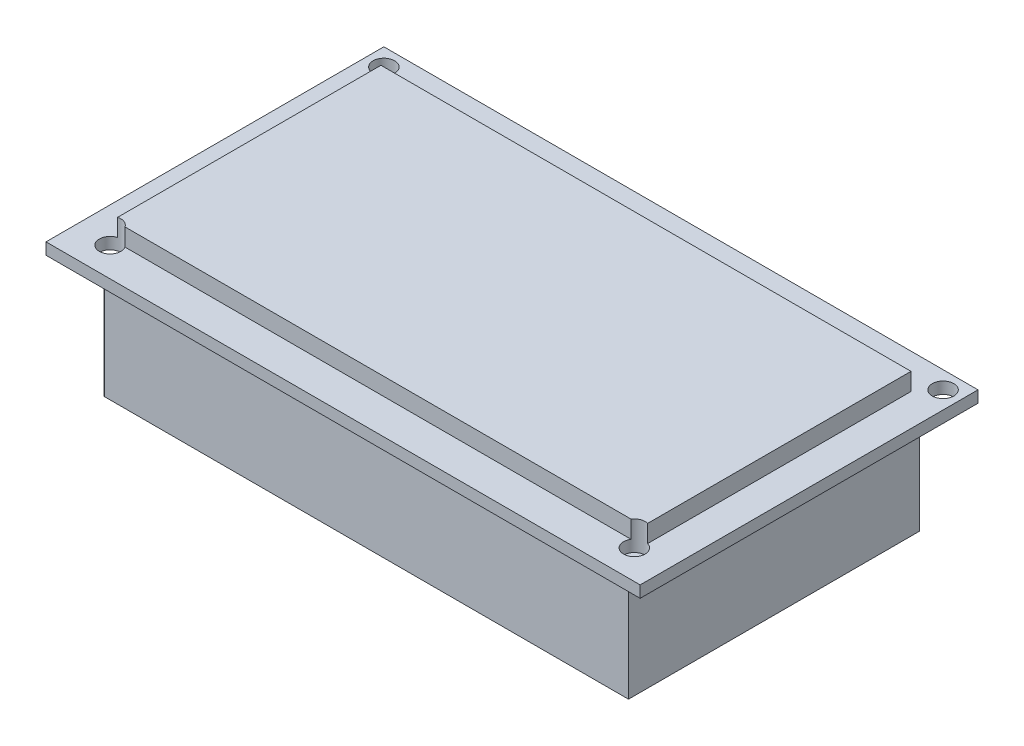
ISO-10303-21;
HEADER;
FILE_DESCRIPTION(('STEP AP214'),'2;1');
FILE_NAME('part.step','',(''),(''),'','','');
FILE_SCHEMA(('AUTOMOTIVE_DESIGN { 1 0 10303 214 1 1 1 1 }'));
ENDSEC;
DATA;
#1=APPLICATION_CONTEXT('core data for automotive mechanical design processes');
#2=APPLICATION_PROTOCOL_DEFINITION('international standard','automotive_design',2000,#1);
#3=PRODUCT_CONTEXT('',#1,'mechanical');
#4=PRODUCT('Part','Part','',(#3));
#5=PRODUCT_RELATED_PRODUCT_CATEGORY('part','',(#4));
#6=PRODUCT_DEFINITION_FORMATION('','',#4);
#7=PRODUCT_DEFINITION_CONTEXT('part definition',#1,'design');
#8=PRODUCT_DEFINITION('design','',#6,#7);
#9=PRODUCT_DEFINITION_SHAPE('','',#8);
#10=(LENGTH_UNIT() NAMED_UNIT(*) SI_UNIT(.MILLI.,.METRE.));
#11=(NAMED_UNIT(*) PLANE_ANGLE_UNIT() SI_UNIT($,.RADIAN.));
#12=(NAMED_UNIT(*) SI_UNIT($,.STERADIAN.) SOLID_ANGLE_UNIT());
#13=UNCERTAINTY_MEASURE_WITH_UNIT(LENGTH_MEASURE(1.E-05),#10,'distance_accuracy_value','');
#14=(GEOMETRIC_REPRESENTATION_CONTEXT(3) GLOBAL_UNCERTAINTY_ASSIGNED_CONTEXT((#13)) GLOBAL_UNIT_ASSIGNED_CONTEXT((#10,
#11,#12)) REPRESENTATION_CONTEXT('',''));
#15=CARTESIAN_POINT('',(0.,0.,0.));
#16=DIRECTION('',(0.,0.,1.));
#17=DIRECTION('',(1.,0.,0.));
#18=AXIS2_PLACEMENT_3D('',#15,#16,#17);
#19=CARTESIAN_POINT('',(0.,0.,0.));
#20=DIRECTION('',(0.,1.,0.));
#21=DIRECTION('',(0.,0.,1.));
#22=AXIS2_PLACEMENT_3D('',#19,#20,#21);
#23=PLANE('',#22);
#24=CARTESIAN_POINT('',(-48.,0.,-26.));
#25=DIRECTION('',(0.,-1.,0.));
#26=DIRECTION('',(0.,0.,-1.));
#27=AXIS2_PLACEMENT_3D('',#24,#25,#26);
#28=CIRCLE('',#27,1.85);
#29=CARTESIAN_POINT('',(-48.,0.,-27.85));
#30=VERTEX_POINT('',#29);
#31=EDGE_CURVE('E347',#30,#30,#28,.T.);
#32=ORIENTED_EDGE('',*,*,#31,.F.);
#33=EDGE_LOOP('',(#32));
#34=FACE_BOUND('',#33,.T.);
#35=CARTESIAN_POINT('',(48.,0.,-26.));
#36=DIRECTION('',(0.,-1.,0.));
#37=DIRECTION('',(0.,0.,-1.));
#38=AXIS2_PLACEMENT_3D('',#35,#36,#37);
#39=CIRCLE('',#38,1.85);
#40=CARTESIAN_POINT('',(48.,0.,-27.85));
#41=VERTEX_POINT('',#40);
#42=EDGE_CURVE('E350',#41,#41,#39,.T.);
#43=ORIENTED_EDGE('',*,*,#42,.F.);
#44=EDGE_LOOP('',(#43));
#45=FACE_BOUND('',#44,.T.);
#46=DIRECTION('',(0.,0.,-1.));
#47=VECTOR('',#46,1.);
#48=CARTESIAN_POINT('',(51.,0.,-29.));
#49=LINE('',#48,#47);
#50=CARTESIAN_POINT('',(51.,0.,29.));
#51=VERTEX_POINT('',#50);
#52=CARTESIAN_POINT('',(51.,0.,-29.));
#53=VERTEX_POINT('',#52);
#54=EDGE_CURVE('E254',#51,#53,#49,.T.);
#55=ORIENTED_EDGE('',*,*,#54,.F.);
#56=DIRECTION('',(1.,0.,0.));
#57=VECTOR('',#56,1.);
#58=CARTESIAN_POINT('',(-51.,0.,29.));
#59=LINE('',#58,#57);
#60=CARTESIAN_POINT('',(-51.,0.,29.));
#61=VERTEX_POINT('',#60);
#62=EDGE_CURVE('E260',#61,#51,#59,.T.);
#63=ORIENTED_EDGE('',*,*,#62,.F.);
#64=DIRECTION('',(0.,0.,1.));
#65=VECTOR('',#64,1.);
#66=CARTESIAN_POINT('',(-51.,0.,-29.));
#67=LINE('',#66,#65);
#68=CARTESIAN_POINT('',(-51.,0.,-29.));
#69=VERTEX_POINT('',#68);
#70=EDGE_CURVE('E276',#69,#61,#67,.T.);
#71=ORIENTED_EDGE('',*,*,#70,.F.);
#72=DIRECTION('',(-1.,0.,0.));
#73=VECTOR('',#72,1.);
#74=CARTESIAN_POINT('',(-51.,0.,-29.));
#75=LINE('',#74,#73);
#76=EDGE_CURVE('E273',#53,#69,#75,.T.);
#77=ORIENTED_EDGE('',*,*,#76,.F.);
#78=EDGE_LOOP('',(#55,#63,#71,#77));
#79=FACE_BOUND('',#78,.T.);
#80=DIRECTION('',(-1.,0.,0.));
#81=VECTOR('',#80,1.);
#82=CARTESIAN_POINT('',(-45.,0.,25.));
#83=LINE('',#82,#81);
#84=CARTESIAN_POINT('',(43.4435617583726,0.,25.));
#85=VERTEX_POINT('',#84);
#86=CARTESIAN_POINT('',(-43.4435617583727,0.,25.));
#87=VERTEX_POINT('',#86);
#88=EDGE_CURVE('E177',#85,#87,#83,.T.);
#89=ORIENTED_EDGE('',*,*,#88,.F.);
#90=CARTESIAN_POINT('',(45.,0.,24.));
#91=DIRECTION('',(0.,-1.,0.));
#92=DIRECTION('',(0.,0.,-1.));
#93=AXIS2_PLACEMENT_3D('',#90,#91,#92);
#94=CIRCLE('',#93,1.85);
#95=CARTESIAN_POINT('',(45.,0.,22.15));
#96=VERTEX_POINT('',#95);
#97=EDGE_CURVE('E182',#96,#85,#94,.T.);
#98=ORIENTED_EDGE('',*,*,#97,.F.);
#99=DIRECTION('',(0.,0.,1.));
#100=VECTOR('',#99,1.);
#101=CARTESIAN_POINT('',(45.,0.,25.));
#102=LINE('',#101,#100);
#103=CARTESIAN_POINT('',(45.,0.,-25.));
#104=VERTEX_POINT('',#103);
#105=EDGE_CURVE('E187',#104,#96,#102,.T.);
#106=ORIENTED_EDGE('',*,*,#105,.F.);
#107=DIRECTION('',(1.,0.,0.));
#108=VECTOR('',#107,1.);
#109=CARTESIAN_POINT('',(-45.,0.,-25.));
#110=LINE('',#109,#108);
#111=CARTESIAN_POINT('',(-45.,0.,-25.));
#112=VERTEX_POINT('',#111);
#113=EDGE_CURVE('E197',#112,#104,#110,.T.);
#114=ORIENTED_EDGE('',*,*,#113,.F.);
#115=DIRECTION('',(0.,0.,-1.));
#116=VECTOR('',#115,1.);
#117=CARTESIAN_POINT('',(-45.,0.,25.));
#118=LINE('',#117,#116);
#119=CARTESIAN_POINT('',(-45.,0.,22.15));
#120=VERTEX_POINT('',#119);
#121=EDGE_CURVE('E180',#120,#112,#118,.T.);
#122=ORIENTED_EDGE('',*,*,#121,.F.);
#123=CARTESIAN_POINT('',(-45.,0.,24.));
#124=DIRECTION('',(0.,-1.,0.));
#125=DIRECTION('',(0.,0.,-1.));
#126=AXIS2_PLACEMENT_3D('',#123,#124,#125);
#127=CIRCLE('',#126,1.85);
#128=EDGE_CURVE('E170',#87,#120,#127,.T.);
#129=ORIENTED_EDGE('',*,*,#128,.F.);
#130=EDGE_LOOP('',(#89,#98,#106,#114,#122,#129));
#131=FACE_BOUND('',#130,.T.);
#132=ADVANCED_FACE('F39',(#34,#45,#79,#131),#23,.F.);
#133=CARTESIAN_POINT('',(51.,2.,-29.));
#134=DIRECTION('',(-1.,0.,0.));
#135=DIRECTION('',(0.,0.,1.));
#136=AXIS2_PLACEMENT_3D('',#133,#134,#135);
#137=PLANE('',#136);
#138=ORIENTED_EDGE('',*,*,#54,.T.);
#139=DIRECTION('',(0.,-1.,0.));
#140=VECTOR('',#139,1.);
#141=CARTESIAN_POINT('',(51.,2.,-29.));
#142=LINE('',#141,#140);
#143=CARTESIAN_POINT('',(51.,2.,-29.));
#144=VERTEX_POINT('',#143);
#145=EDGE_CURVE('E292',#144,#53,#142,.T.);
#146=ORIENTED_EDGE('',*,*,#145,.F.);
#147=DIRECTION('',(0.,0.,-1.));
#148=VECTOR('',#147,1.);
#149=CARTESIAN_POINT('',(51.,2.,-29.));
#150=LINE('',#149,#148);
#151=CARTESIAN_POINT('',(51.,2.,29.));
#152=VERTEX_POINT('',#151);
#153=EDGE_CURVE('E255',#152,#144,#150,.T.);
#154=ORIENTED_EDGE('',*,*,#153,.F.);
#155=DIRECTION('',(0.,-1.,0.));
#156=VECTOR('',#155,1.);
#157=CARTESIAN_POINT('',(51.,2.,29.));
#158=LINE('',#157,#156);
#159=EDGE_CURVE('E269',#152,#51,#158,.T.);
#160=ORIENTED_EDGE('',*,*,#159,.T.);
#161=EDGE_LOOP('',(#138,#146,#154,#160));
#162=FACE_BOUND('',#161,.T.);
#163=ADVANCED_FACE('F41',(#162),#137,.F.);
#164=CARTESIAN_POINT('',(-51.,2.,-29.));
#165=DIRECTION('',(0.,0.,1.));
#166=DIRECTION('',(1.,0.,0.));
#167=AXIS2_PLACEMENT_3D('',#164,#165,#166);
#168=PLANE('',#167);
#169=ORIENTED_EDGE('',*,*,#76,.T.);
#170=DIRECTION('',(0.,-1.,0.));
#171=VECTOR('',#170,1.);
#172=CARTESIAN_POINT('',(-51.,2.,-29.));
#173=LINE('',#172,#171);
#174=CARTESIAN_POINT('',(-51.,2.,-29.));
#175=VERTEX_POINT('',#174);
#176=EDGE_CURVE('E288',#175,#69,#173,.T.);
#177=ORIENTED_EDGE('',*,*,#176,.F.);
#178=DIRECTION('',(-1.,0.,0.));
#179=VECTOR('',#178,1.);
#180=CARTESIAN_POINT('',(-51.,2.,-29.));
#181=LINE('',#180,#179);
#182=EDGE_CURVE('E259',#144,#175,#181,.T.);
#183=ORIENTED_EDGE('',*,*,#182,.F.);
#184=ORIENTED_EDGE('',*,*,#145,.T.);
#185=EDGE_LOOP('',(#169,#177,#183,#184));
#186=FACE_BOUND('',#185,.T.);
#187=ADVANCED_FACE('F406',(#186),#168,.F.);
#188=CARTESIAN_POINT('',(-51.,2.,-29.));
#189=DIRECTION('',(1.,0.,0.));
#190=DIRECTION('',(0.,0.,-1.));
#191=AXIS2_PLACEMENT_3D('',#188,#189,#190);
#192=PLANE('',#191);
#193=ORIENTED_EDGE('',*,*,#70,.T.);
#194=DIRECTION('',(0.,-1.,0.));
#195=VECTOR('',#194,1.);
#196=CARTESIAN_POINT('',(-51.,2.,29.));
#197=LINE('',#196,#195);
#198=CARTESIAN_POINT('',(-51.,2.,29.));
#199=VERTEX_POINT('',#198);
#200=EDGE_CURVE('E284',#199,#61,#197,.T.);
#201=ORIENTED_EDGE('',*,*,#200,.F.);
#202=DIRECTION('',(0.,0.,1.));
#203=VECTOR('',#202,1.);
#204=CARTESIAN_POINT('',(-51.,2.,-29.));
#205=LINE('',#204,#203);
#206=EDGE_CURVE('E263',#175,#199,#205,.T.);
#207=ORIENTED_EDGE('',*,*,#206,.F.);
#208=ORIENTED_EDGE('',*,*,#176,.T.);
#209=EDGE_LOOP('',(#193,#201,#207,#208));
#210=FACE_BOUND('',#209,.T.);
#211=ADVANCED_FACE('F416',(#210),#192,.F.);
#212=CARTESIAN_POINT('',(-51.,2.,29.));
#213=DIRECTION('',(0.,0.,-1.));
#214=DIRECTION('',(-1.,0.,0.));
#215=AXIS2_PLACEMENT_3D('',#212,#213,#214);
#216=PLANE('',#215);
#217=ORIENTED_EDGE('',*,*,#62,.T.);
#218=ORIENTED_EDGE('',*,*,#159,.F.);
#219=DIRECTION('',(1.,0.,0.));
#220=VECTOR('',#219,1.);
#221=CARTESIAN_POINT('',(-51.,2.,29.));
#222=LINE('',#221,#220);
#223=EDGE_CURVE('E266',#199,#152,#222,.T.);
#224=ORIENTED_EDGE('',*,*,#223,.F.);
#225=ORIENTED_EDGE('',*,*,#200,.T.);
#226=EDGE_LOOP('',(#217,#218,#224,#225));
#227=FACE_BOUND('',#226,.T.);
#228=ADVANCED_FACE('F413',(#227),#216,.F.);
#229=CARTESIAN_POINT('',(0.,2.,0.));
#230=DIRECTION('',(0.,1.,0.));
#231=DIRECTION('',(0.,0.,1.));
#232=AXIS2_PLACEMENT_3D('',#229,#230,#231);
#233=PLANE('',#232);
#234=CARTESIAN_POINT('',(45.,2.,24.));
#235=DIRECTION('',(0.,1.,0.));
#236=DIRECTION('',(0.,0.,1.));
#237=AXIS2_PLACEMENT_3D('',#234,#235,#236);
#238=CIRCLE('',#237,1.85);
#239=CARTESIAN_POINT('',(43.4435617583727,2.,23.));
#240=VERTEX_POINT('',#239);
#241=CARTESIAN_POINT('',(45.5,2.,22.2188486869443));
#242=VERTEX_POINT('',#241);
#243=EDGE_CURVE('E305',#240,#242,#238,.T.);
#244=ORIENTED_EDGE('',*,*,#243,.F.);
#245=DIRECTION('',(1.,0.,0.));
#246=VECTOR('',#245,1.);
#247=CARTESIAN_POINT('',(-45.5,2.,23.));
#248=LINE('',#247,#246);
#249=CARTESIAN_POINT('',(-43.4435617583727,2.,23.));
#250=VERTEX_POINT('',#249);
#251=EDGE_CURVE('E222',#250,#240,#248,.T.);
#252=ORIENTED_EDGE('',*,*,#251,.F.);
#253=CARTESIAN_POINT('',(-45.,2.,24.));
#254=DIRECTION('',(0.,1.,0.));
#255=DIRECTION('',(0.,0.,1.));
#256=AXIS2_PLACEMENT_3D('',#253,#254,#255);
#257=CIRCLE('',#256,1.85);
#258=CARTESIAN_POINT('',(-45.5,2.,22.2188486869443));
#259=VERTEX_POINT('',#258);
#260=EDGE_CURVE('E358',#259,#250,#257,.T.);
#261=ORIENTED_EDGE('',*,*,#260,.F.);
#262=DIRECTION('',(0.,0.,1.));
#263=VECTOR('',#262,1.);
#264=CARTESIAN_POINT('',(-45.5,2.,-23.));
#265=LINE('',#264,#263);
#266=CARTESIAN_POINT('',(-45.5,2.,-23.));
#267=VERTEX_POINT('',#266);
#268=EDGE_CURVE('E240',#267,#259,#265,.T.);
#269=ORIENTED_EDGE('',*,*,#268,.F.);
#270=DIRECTION('',(-1.,0.,0.));
#271=VECTOR('',#270,1.);
#272=CARTESIAN_POINT('',(-45.5,2.,-23.));
#273=LINE('',#272,#271);
#274=CARTESIAN_POINT('',(45.5,2.,-23.));
#275=VERTEX_POINT('',#274);
#276=EDGE_CURVE('E236',#275,#267,#273,.T.);
#277=ORIENTED_EDGE('',*,*,#276,.F.);
#278=DIRECTION('',(0.,0.,-1.));
#279=VECTOR('',#278,1.);
#280=CARTESIAN_POINT('',(45.5,2.,-23.));
#281=LINE('',#280,#279);
#282=EDGE_CURVE('E217',#242,#275,#281,.T.);
#283=ORIENTED_EDGE('',*,*,#282,.F.);
#284=EDGE_LOOP('',(#244,#252,#261,#269,#277,#283));
#285=FACE_BOUND('',#284,.T.);
#286=CARTESIAN_POINT('',(-48.,2.,-26.));
#287=DIRECTION('',(0.,1.,0.));
#288=DIRECTION('',(0.,0.,1.));
#289=AXIS2_PLACEMENT_3D('',#286,#287,#288);
#290=CIRCLE('',#289,1.85);
#291=CARTESIAN_POINT('',(-48.,2.,-24.15));
#292=VERTEX_POINT('',#291);
#293=EDGE_CURVE('E43',#292,#292,#290,.T.);
#294=ORIENTED_EDGE('',*,*,#293,.F.);
#295=EDGE_LOOP('',(#294));
#296=FACE_BOUND('',#295,.T.);
#297=CARTESIAN_POINT('',(48.,2.,-26.));
#298=DIRECTION('',(0.,1.,0.));
#299=DIRECTION('',(0.,0.,1.));
#300=AXIS2_PLACEMENT_3D('',#297,#298,#299);
#301=CIRCLE('',#300,1.85);
#302=CARTESIAN_POINT('',(48.,2.,-24.15));
#303=VERTEX_POINT('',#302);
#304=EDGE_CURVE('E297',#303,#303,#301,.T.);
#305=ORIENTED_EDGE('',*,*,#304,.F.);
#306=EDGE_LOOP('',(#305));
#307=FACE_BOUND('',#306,.T.);
#308=ORIENTED_EDGE('',*,*,#153,.T.);
#309=ORIENTED_EDGE('',*,*,#182,.T.);
#310=ORIENTED_EDGE('',*,*,#206,.T.);
#311=ORIENTED_EDGE('',*,*,#223,.T.);
#312=EDGE_LOOP('',(#308,#309,#310,#311));
#313=FACE_BOUND('',#312,.T.);
#314=ADVANCED_FACE('F380',(#285,#296,#307,#313),#233,.T.);
#315=CARTESIAN_POINT('',(45.5,5.,-23.));
#316=DIRECTION('',(-1.,0.,0.));
#317=DIRECTION('',(0.,0.,1.));
#318=AXIS2_PLACEMENT_3D('',#315,#316,#317);
#319=PLANE('',#318);
#320=DIRECTION('',(0.,0.,-1.));
#321=VECTOR('',#320,1.);
#322=CARTESIAN_POINT('',(45.5,5.,-23.));
#323=LINE('',#322,#321);
#324=CARTESIAN_POINT('',(45.5,5.,22.2188486869443));
#325=VERTEX_POINT('',#324);
#326=CARTESIAN_POINT('',(45.5,5.,-23.));
#327=VERTEX_POINT('',#326);
#328=EDGE_CURVE('E218',#325,#327,#323,.T.);
#329=ORIENTED_EDGE('',*,*,#328,.F.);
#330=DIRECTION('',(0.,-1.,0.));
#331=VECTOR('',#330,1.);
#332=CARTESIAN_POINT('',(45.5,5.,22.2188486869443));
#333=LINE('',#332,#331);
#334=EDGE_CURVE('E64',#325,#242,#333,.T.);
#335=ORIENTED_EDGE('',*,*,#334,.T.);
#336=ORIENTED_EDGE('',*,*,#282,.T.);
#337=DIRECTION('',(0.,-1.,0.));
#338=VECTOR('',#337,1.);
#339=CARTESIAN_POINT('',(45.5,5.,-23.));
#340=LINE('',#339,#338);
#341=EDGE_CURVE('E250',#327,#275,#340,.T.);
#342=ORIENTED_EDGE('',*,*,#341,.F.);
#343=EDGE_LOOP('',(#329,#335,#336,#342));
#344=FACE_BOUND('',#343,.T.);
#345=ADVANCED_FACE('F386',(#344),#319,.F.);
#346=CARTESIAN_POINT('',(-45.5,5.,-23.));
#347=DIRECTION('',(0.,0.,1.));
#348=DIRECTION('',(1.,0.,0.));
#349=AXIS2_PLACEMENT_3D('',#346,#347,#348);
#350=PLANE('',#349);
#351=ORIENTED_EDGE('',*,*,#276,.T.);
#352=DIRECTION('',(0.,-1.,0.));
#353=VECTOR('',#352,1.);
#354=CARTESIAN_POINT('',(-45.5,5.,-23.));
#355=LINE('',#354,#353);
#356=CARTESIAN_POINT('',(-45.5,5.,-23.));
#357=VERTEX_POINT('',#356);
#358=EDGE_CURVE('E233',#357,#267,#355,.T.);
#359=ORIENTED_EDGE('',*,*,#358,.F.);
#360=DIRECTION('',(-1.,0.,0.));
#361=VECTOR('',#360,1.);
#362=CARTESIAN_POINT('',(-45.5,5.,-23.));
#363=LINE('',#362,#361);
#364=EDGE_CURVE('E221',#327,#357,#363,.T.);
#365=ORIENTED_EDGE('',*,*,#364,.F.);
#366=ORIENTED_EDGE('',*,*,#341,.T.);
#367=EDGE_LOOP('',(#351,#359,#365,#366));
#368=FACE_BOUND('',#367,.T.);
#369=ADVANCED_FACE('F383',(#368),#350,.F.);
#370=CARTESIAN_POINT('',(-45.5,5.,-23.));
#371=DIRECTION('',(1.,0.,0.));
#372=DIRECTION('',(0.,0.,-1.));
#373=AXIS2_PLACEMENT_3D('',#370,#371,#372);
#374=PLANE('',#373);
#375=ORIENTED_EDGE('',*,*,#268,.T.);
#376=DIRECTION('',(0.,-1.,0.));
#377=VECTOR('',#376,1.);
#378=CARTESIAN_POINT('',(-45.5,5.,22.2188486869443));
#379=LINE('',#378,#377);
#380=CARTESIAN_POINT('',(-45.5,5.,22.2188486869443));
#381=VERTEX_POINT('',#380);
#382=EDGE_CURVE('E361',#259,#381,#379,.F.);
#383=ORIENTED_EDGE('',*,*,#382,.T.);
#384=DIRECTION('',(0.,0.,1.));
#385=VECTOR('',#384,1.);
#386=CARTESIAN_POINT('',(-45.5,5.,-23.));
#387=LINE('',#386,#385);
#388=EDGE_CURVE('E225',#357,#381,#387,.T.);
#389=ORIENTED_EDGE('',*,*,#388,.F.);
#390=ORIENTED_EDGE('',*,*,#358,.T.);
#391=EDGE_LOOP('',(#375,#383,#389,#390));
#392=FACE_BOUND('',#391,.T.);
#393=ADVANCED_FACE('F376',(#392),#374,.F.);
#394=CARTESIAN_POINT('',(-45.5,5.,23.));
#395=DIRECTION('',(0.,0.,-1.));
#396=DIRECTION('',(-1.,0.,0.));
#397=AXIS2_PLACEMENT_3D('',#394,#395,#396);
#398=PLANE('',#397);
#399=ORIENTED_EDGE('',*,*,#251,.T.);
#400=DIRECTION('',(0.,-1.,0.));
#401=VECTOR('',#400,1.);
#402=CARTESIAN_POINT('',(43.4435617583727,5.,23.));
#403=LINE('',#402,#401);
#404=CARTESIAN_POINT('',(43.4435617583727,5.,23.));
#405=VERTEX_POINT('',#404);
#406=EDGE_CURVE('E311',#240,#405,#403,.F.);
#407=ORIENTED_EDGE('',*,*,#406,.T.);
#408=DIRECTION('',(1.,0.,0.));
#409=VECTOR('',#408,1.);
#410=CARTESIAN_POINT('',(-45.5,5.,23.));
#411=LINE('',#410,#409);
#412=CARTESIAN_POINT('',(-43.4435617583727,5.,23.));
#413=VERTEX_POINT('',#412);
#414=EDGE_CURVE('E229',#413,#405,#411,.T.);
#415=ORIENTED_EDGE('',*,*,#414,.F.);
#416=DIRECTION('',(0.,-1.,0.));
#417=VECTOR('',#416,1.);
#418=CARTESIAN_POINT('',(-43.4435617583727,5.,23.));
#419=LINE('',#418,#417);
#420=EDGE_CURVE('E57',#413,#250,#419,.T.);
#421=ORIENTED_EDGE('',*,*,#420,.T.);
#422=EDGE_LOOP('',(#399,#407,#415,#421));
#423=FACE_BOUND('',#422,.T.);
#424=ADVANCED_FACE('F368',(#423),#398,.F.);
#425=CARTESIAN_POINT('',(0.,5.,0.));
#426=DIRECTION('',(0.,1.,0.));
#427=DIRECTION('',(0.,0.,1.));
#428=AXIS2_PLACEMENT_3D('',#425,#426,#427);
#429=PLANE('',#428);
#430=CARTESIAN_POINT('',(45.,5.,24.));
#431=DIRECTION('',(0.,1.,0.));
#432=DIRECTION('',(0.,0.,1.));
#433=AXIS2_PLACEMENT_3D('',#430,#431,#432);
#434=CIRCLE('',#433,1.85);
#435=EDGE_CURVE('E11',#325,#405,#434,.T.);
#436=ORIENTED_EDGE('',*,*,#435,.F.);
#437=ORIENTED_EDGE('',*,*,#328,.T.);
#438=ORIENTED_EDGE('',*,*,#364,.T.);
#439=ORIENTED_EDGE('',*,*,#388,.T.);
#440=CARTESIAN_POINT('',(-45.,5.,24.));
#441=DIRECTION('',(0.,1.,0.));
#442=DIRECTION('',(0.,0.,1.));
#443=AXIS2_PLACEMENT_3D('',#440,#441,#442);
#444=CIRCLE('',#443,1.85);
#445=EDGE_CURVE('E49',#413,#381,#444,.T.);
#446=ORIENTED_EDGE('',*,*,#445,.F.);
#447=ORIENTED_EDGE('',*,*,#414,.T.);
#448=EDGE_LOOP('',(#436,#437,#438,#439,#446,#447));
#449=FACE_BOUND('',#448,.T.);
#450=ADVANCED_FACE('F372',(#449),#429,.T.);
#451=CARTESIAN_POINT('',(45.,-20.,25.));
#452=DIRECTION('',(-1.,0.,0.));
#453=DIRECTION('',(0.,0.,1.));
#454=AXIS2_PLACEMENT_3D('',#451,#452,#453);
#455=PLANE('',#454);
#456=ORIENTED_EDGE('',*,*,#105,.T.);
#457=DIRECTION('',(0.,0.,1.));
#458=VECTOR('',#457,1.);
#459=CARTESIAN_POINT('',(45.,0.,25.));
#460=LINE('',#459,#458);
#461=CARTESIAN_POINT('',(45.,0.,25.));
#462=VERTEX_POINT('',#461);
#463=EDGE_CURVE('E165',#96,#462,#460,.T.);
#464=ORIENTED_EDGE('',*,*,#463,.T.);
#465=DIRECTION('',(0.,1.,0.));
#466=VECTOR('',#465,1.);
#467=CARTESIAN_POINT('',(45.,-20.,25.));
#468=LINE('',#467,#466);
#469=CARTESIAN_POINT('',(45.,-20.,25.));
#470=VERTEX_POINT('',#469);
#471=EDGE_CURVE('E214',#470,#462,#468,.T.);
#472=ORIENTED_EDGE('',*,*,#471,.F.);
#473=DIRECTION('',(0.,0.,1.));
#474=VECTOR('',#473,1.);
#475=CARTESIAN_POINT('',(45.,-20.,25.));
#476=LINE('',#475,#474);
#477=CARTESIAN_POINT('',(45.,-20.,-25.));
#478=VERTEX_POINT('',#477);
#479=EDGE_CURVE('E201',#478,#470,#476,.T.);
#480=ORIENTED_EDGE('',*,*,#479,.F.);
#481=DIRECTION('',(0.,1.,0.));
#482=VECTOR('',#481,1.);
#483=CARTESIAN_POINT('',(45.,-20.,-25.));
#484=LINE('',#483,#482);
#485=EDGE_CURVE('E202',#478,#104,#484,.T.);
#486=ORIENTED_EDGE('',*,*,#485,.T.);
#487=EDGE_LOOP('',(#456,#464,#472,#480,#486));
#488=FACE_BOUND('',#487,.T.);
#489=ADVANCED_FACE('F335',(#488),#455,.F.);
#490=CARTESIAN_POINT('',(-45.,-20.,25.));
#491=DIRECTION('',(0.,0.,-1.));
#492=DIRECTION('',(-1.,0.,0.));
#493=AXIS2_PLACEMENT_3D('',#490,#491,#492);
#494=PLANE('',#493);
#495=EDGE_CURVE('E185',#462,#85,#83,.T.);
#496=ORIENTED_EDGE('',*,*,#495,.T.);
#497=ORIENTED_EDGE('',*,*,#88,.T.);
#498=DIRECTION('',(-1.,0.,0.));
#499=VECTOR('',#498,1.);
#500=CARTESIAN_POINT('',(-45.,0.,25.));
#501=LINE('',#500,#499);
#502=CARTESIAN_POINT('',(-45.,0.,25.));
#503=VERTEX_POINT('',#502);
#504=EDGE_CURVE('E153',#87,#503,#501,.T.);
#505=ORIENTED_EDGE('',*,*,#504,.T.);
#506=DIRECTION('',(0.,1.,0.));
#507=VECTOR('',#506,1.);
#508=CARTESIAN_POINT('',(-45.,-20.,25.));
#509=LINE('',#508,#507);
#510=CARTESIAN_POINT('',(-45.,-20.,25.));
#511=VERTEX_POINT('',#510);
#512=EDGE_CURVE('E211',#511,#503,#509,.T.);
#513=ORIENTED_EDGE('',*,*,#512,.F.);
#514=DIRECTION('',(-1.,0.,0.));
#515=VECTOR('',#514,1.);
#516=CARTESIAN_POINT('',(-45.,-20.,25.));
#517=LINE('',#516,#515);
#518=EDGE_CURVE('E318',#470,#511,#517,.T.);
#519=ORIENTED_EDGE('',*,*,#518,.F.);
#520=ORIENTED_EDGE('',*,*,#471,.T.);
#521=EDGE_LOOP('',(#496,#497,#505,#513,#519,#520));
#522=FACE_BOUND('',#521,.T.);
#523=ADVANCED_FACE('F183',(#522),#494,.F.);
#524=CARTESIAN_POINT('',(-45.,-20.,25.));
#525=DIRECTION('',(1.,0.,0.));
#526=DIRECTION('',(0.,0.,-1.));
#527=AXIS2_PLACEMENT_3D('',#524,#525,#526);
#528=PLANE('',#527);
#529=EDGE_CURVE('E159',#503,#120,#118,.T.);
#530=ORIENTED_EDGE('',*,*,#529,.T.);
#531=ORIENTED_EDGE('',*,*,#121,.T.);
#532=DIRECTION('',(0.,1.,0.));
#533=VECTOR('',#532,1.);
#534=CARTESIAN_POINT('',(-45.,-20.,-25.));
#535=LINE('',#534,#533);
#536=CARTESIAN_POINT('',(-45.,-20.,-25.));
#537=VERTEX_POINT('',#536);
#538=EDGE_CURVE('E206',#537,#112,#535,.T.);
#539=ORIENTED_EDGE('',*,*,#538,.F.);
#540=DIRECTION('',(0.,0.,-1.));
#541=VECTOR('',#540,1.);
#542=CARTESIAN_POINT('',(-45.,-20.,25.));
#543=LINE('',#542,#541);
#544=EDGE_CURVE('E321',#511,#537,#543,.T.);
#545=ORIENTED_EDGE('',*,*,#544,.F.);
#546=ORIENTED_EDGE('',*,*,#512,.T.);
#547=EDGE_LOOP('',(#530,#531,#539,#545,#546));
#548=FACE_BOUND('',#547,.T.);
#549=ADVANCED_FACE('F338',(#548),#528,.F.);
#550=CARTESIAN_POINT('',(-45.,-20.,-25.));
#551=DIRECTION('',(0.,0.,1.));
#552=DIRECTION('',(1.,0.,0.));
#553=AXIS2_PLACEMENT_3D('',#550,#551,#552);
#554=PLANE('',#553);
#555=ORIENTED_EDGE('',*,*,#113,.T.);
#556=ORIENTED_EDGE('',*,*,#485,.F.);
#557=DIRECTION('',(1.,0.,0.));
#558=VECTOR('',#557,1.);
#559=CARTESIAN_POINT('',(-45.,-20.,-25.));
#560=LINE('',#559,#558);
#561=EDGE_CURVE('E207',#537,#478,#560,.T.);
#562=ORIENTED_EDGE('',*,*,#561,.F.);
#563=ORIENTED_EDGE('',*,*,#538,.T.);
#564=EDGE_LOOP('',(#555,#556,#562,#563));
#565=FACE_BOUND('',#564,.T.);
#566=ADVANCED_FACE('F333',(#565),#554,.F.);
#567=CARTESIAN_POINT('',(0.,-20.,0.));
#568=DIRECTION('',(0.,-1.,0.));
#569=DIRECTION('',(0.,0.,-1.));
#570=AXIS2_PLACEMENT_3D('',#567,#568,#569);
#571=PLANE('',#570);
#572=ORIENTED_EDGE('',*,*,#479,.T.);
#573=ORIENTED_EDGE('',*,*,#518,.T.);
#574=ORIENTED_EDGE('',*,*,#544,.T.);
#575=ORIENTED_EDGE('',*,*,#561,.T.);
#576=EDGE_LOOP('',(#572,#573,#574,#575));
#577=FACE_BOUND('',#576,.T.);
#578=ADVANCED_FACE('F327',(#577),#571,.T.);
#579=CARTESIAN_POINT('',(-45.,5.,24.));
#580=DIRECTION('',(0.,-1.,0.));
#581=DIRECTION('',(0.,0.,-1.));
#582=AXIS2_PLACEMENT_3D('',#579,#580,#581);
#583=CYLINDRICAL_SURFACE('',#582,1.85);
#584=EDGE_CURVE('E156',#120,#87,#127,.T.);
#585=ORIENTED_EDGE('',*,*,#584,.T.);
#586=ORIENTED_EDGE('',*,*,#128,.T.);
#587=EDGE_LOOP('',(#585,#586));
#588=FACE_BOUND('',#587,.T.);
#589=ORIENTED_EDGE('',*,*,#260,.T.);
#590=ORIENTED_EDGE('',*,*,#420,.F.);
#591=ORIENTED_EDGE('',*,*,#445,.T.);
#592=ORIENTED_EDGE('',*,*,#382,.F.);
#593=EDGE_LOOP('',(#589,#590,#591,#592));
#594=FACE_BOUND('',#593,.T.);
#595=ADVANCED_FACE('F169',(#588,#594),#583,.F.);
#596=CARTESIAN_POINT('',(-45.,0.,24.));
#597=DIRECTION('',(0.,-1.,0.));
#598=DIRECTION('',(0.,0.,-1.));
#599=AXIS2_PLACEMENT_3D('',#596,#597,#598);
#600=PLANE('',#599);
#601=ORIENTED_EDGE('',*,*,#584,.F.);
#602=ORIENTED_EDGE('',*,*,#529,.F.);
#603=ORIENTED_EDGE('',*,*,#504,.F.);
#604=EDGE_LOOP('',(#601,#602,#603));
#605=FACE_BOUND('',#604,.T.);
#606=ADVANCED_FACE('F155',(#605),#600,.F.);
#607=CARTESIAN_POINT('',(45.,5.,24.));
#608=DIRECTION('',(0.,-1.,0.));
#609=DIRECTION('',(0.,0.,-1.));
#610=AXIS2_PLACEMENT_3D('',#607,#608,#609);
#611=CYLINDRICAL_SURFACE('',#610,1.85);
#612=ORIENTED_EDGE('',*,*,#97,.T.);
#613=EDGE_CURVE('E344',#85,#96,#94,.T.);
#614=ORIENTED_EDGE('',*,*,#613,.T.);
#615=EDGE_LOOP('',(#612,#614));
#616=FACE_BOUND('',#615,.T.);
#617=ORIENTED_EDGE('',*,*,#435,.T.);
#618=ORIENTED_EDGE('',*,*,#406,.F.);
#619=ORIENTED_EDGE('',*,*,#243,.T.);
#620=ORIENTED_EDGE('',*,*,#334,.F.);
#621=EDGE_LOOP('',(#617,#618,#619,#620));
#622=FACE_BOUND('',#621,.T.);
#623=ADVANCED_FACE('F387',(#616,#622),#611,.F.);
#624=CARTESIAN_POINT('',(45.,0.,24.));
#625=DIRECTION('',(0.,-1.,0.));
#626=DIRECTION('',(0.,0.,-1.));
#627=AXIS2_PLACEMENT_3D('',#624,#625,#626);
#628=PLANE('',#627);
#629=ORIENTED_EDGE('',*,*,#613,.F.);
#630=ORIENTED_EDGE('',*,*,#495,.F.);
#631=ORIENTED_EDGE('',*,*,#463,.F.);
#632=EDGE_LOOP('',(#629,#630,#631));
#633=FACE_BOUND('',#632,.T.);
#634=ADVANCED_FACE('F389',(#633),#628,.F.);
#635=CARTESIAN_POINT('',(48.,5.,-26.));
#636=DIRECTION('',(0.,-1.,0.));
#637=DIRECTION('',(0.,0.,-1.));
#638=AXIS2_PLACEMENT_3D('',#635,#636,#637);
#639=CYLINDRICAL_SURFACE('',#638,1.85);
#640=ORIENTED_EDGE('',*,*,#304,.T.);
#641=EDGE_LOOP('',(#640));
#642=FACE_BOUND('',#641,.T.);
#643=ORIENTED_EDGE('',*,*,#42,.T.);
#644=EDGE_LOOP('',(#643));
#645=FACE_BOUND('',#644,.T.);
#646=ADVANCED_FACE('F395',(#642,#645),#639,.F.);
#647=CARTESIAN_POINT('',(-48.,5.,-26.));
#648=DIRECTION('',(0.,-1.,0.));
#649=DIRECTION('',(0.,0.,-1.));
#650=AXIS2_PLACEMENT_3D('',#647,#648,#649);
#651=CYLINDRICAL_SURFACE('',#650,1.85);
#652=ORIENTED_EDGE('',*,*,#293,.T.);
#653=EDGE_LOOP('',(#652));
#654=FACE_BOUND('',#653,.T.);
#655=ORIENTED_EDGE('',*,*,#31,.T.);
#656=EDGE_LOOP('',(#655));
#657=FACE_BOUND('',#656,.T.);
#658=ADVANCED_FACE('F462',(#654,#657),#651,.F.);
#659=CLOSED_SHELL('',(#132,#163,#187,#211,#228,#314,#345,#369,#393,#424,#450,#489,#523,#549,
#566,#578,#595,#606,#623,#634,#646,#658));
#660=MANIFOLD_SOLID_BREP('B2',#659);
#661=ADVANCED_BREP_SHAPE_REPRESENTATION('',(#18,#660),#14);
#662=SHAPE_DEFINITION_REPRESENTATION(#9,#661);
ENDSEC;
END-ISO-10303-21;
